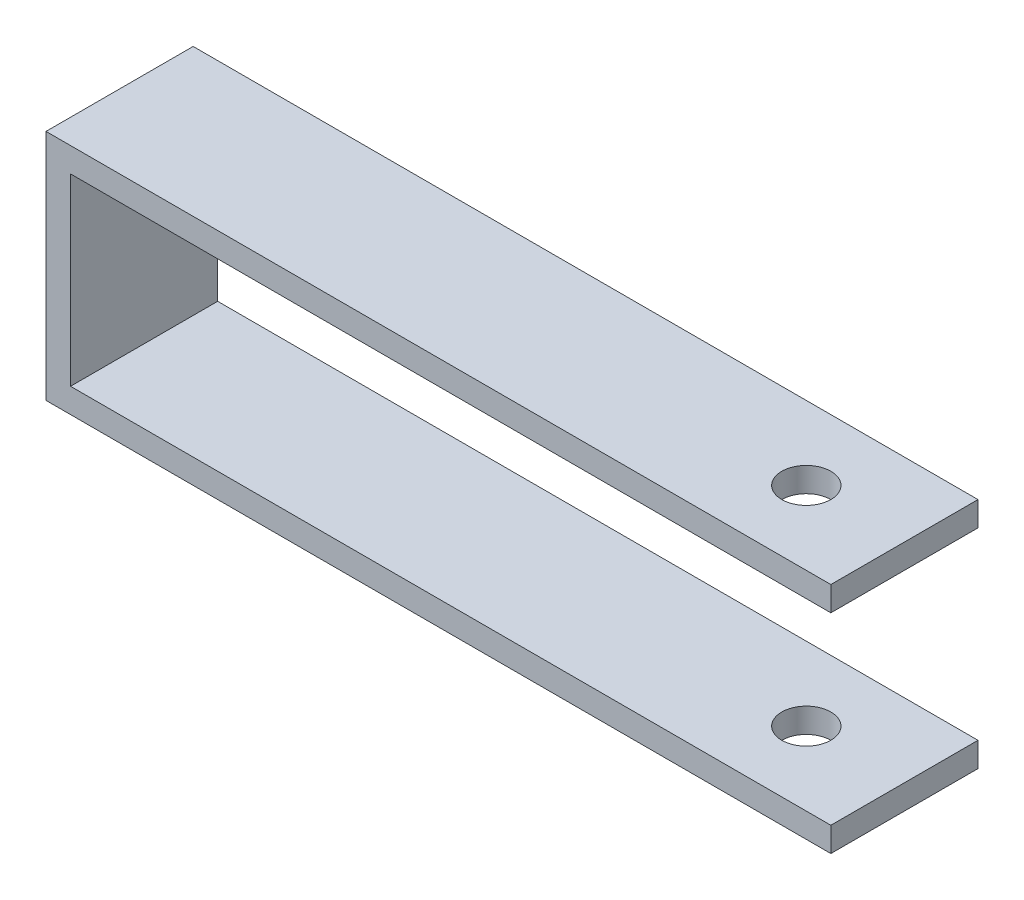
ISO-10303-21;
HEADER;
FILE_DESCRIPTION(('STEP AP214'),'2;1');
FILE_NAME('part.step','',(''),(''),'','','');
FILE_SCHEMA(('AUTOMOTIVE_DESIGN { 1 0 10303 214 1 1 1 1 }'));
ENDSEC;
DATA;
#1=APPLICATION_CONTEXT('core data for automotive mechanical design processes');
#2=APPLICATION_PROTOCOL_DEFINITION('international standard','automotive_design',2000,#1);
#3=PRODUCT_CONTEXT('',#1,'mechanical');
#4=PRODUCT('Part','Part','',(#3));
#5=PRODUCT_RELATED_PRODUCT_CATEGORY('part','',(#4));
#6=PRODUCT_DEFINITION_FORMATION('','',#4);
#7=PRODUCT_DEFINITION_CONTEXT('part definition',#1,'design');
#8=PRODUCT_DEFINITION('design','',#6,#7);
#9=PRODUCT_DEFINITION_SHAPE('','',#8);
#10=(LENGTH_UNIT() NAMED_UNIT(*) SI_UNIT(.MILLI.,.METRE.));
#11=(NAMED_UNIT(*) PLANE_ANGLE_UNIT() SI_UNIT($,.RADIAN.));
#12=(NAMED_UNIT(*) SI_UNIT($,.STERADIAN.) SOLID_ANGLE_UNIT());
#13=UNCERTAINTY_MEASURE_WITH_UNIT(LENGTH_MEASURE(1.E-05),#10,'distance_accuracy_value','');
#14=(GEOMETRIC_REPRESENTATION_CONTEXT(3) GLOBAL_UNCERTAINTY_ASSIGNED_CONTEXT((#13)) GLOBAL_UNIT_ASSIGNED_CONTEXT((#10,
#11,#12)) REPRESENTATION_CONTEXT('',''));
#15=CARTESIAN_POINT('',(0.,0.,0.));
#16=DIRECTION('',(0.,0.,1.));
#17=DIRECTION('',(1.,0.,0.));
#18=AXIS2_PLACEMENT_3D('',#15,#16,#17);
#19=CARTESIAN_POINT('',(-152.367582317073,0.,0.));
#20=DIRECTION('',(1.,0.,0.));
#21=DIRECTION('',(0.,0.,-1.));
#22=AXIS2_PLACEMENT_3D('',#19,#20,#21);
#23=PLANE('',#22);
#24=DIRECTION('',(0.,-1.,0.));
#25=VECTOR('',#24,1.);
#26=CARTESIAN_POINT('',(-152.367582317073,30.1625,-35.2174878048781));
#27=LINE('',#26,#25);
#28=CARTESIAN_POINT('',(-152.367582317073,26.9875,-35.2174878048781));
#29=VERTEX_POINT('',#28);
#30=CARTESIAN_POINT('',(-152.367582317073,3.175,-35.2174878048781));
#31=VERTEX_POINT('',#30);
#32=EDGE_CURVE('E53',#29,#31,#27,.T.);
#33=ORIENTED_EDGE('',*,*,#32,.F.);
#34=DIRECTION('',(0.,0.,1.));
#35=VECTOR('',#34,1.);
#36=CARTESIAN_POINT('',(-152.367582317073,26.9875,0.));
#37=LINE('',#36,#35);
#38=CARTESIAN_POINT('',(-152.367582317073,26.9875,-16.167487804878));
#39=VERTEX_POINT('',#38);
#40=EDGE_CURVE('E11',#29,#39,#37,.T.);
#41=ORIENTED_EDGE('',*,*,#40,.T.);
#42=DIRECTION('',(0.,1.,0.));
#43=VECTOR('',#42,1.);
#44=CARTESIAN_POINT('',(-152.367582317073,30.1625,-16.167487804878));
#45=LINE('',#44,#43);
#46=CARTESIAN_POINT('',(-152.367582317073,3.175,-16.167487804878));
#47=VERTEX_POINT('',#46);
#48=EDGE_CURVE('E134',#47,#39,#45,.T.);
#49=ORIENTED_EDGE('',*,*,#48,.F.);
#50=DIRECTION('',(0.,0.,-1.));
#51=VECTOR('',#50,1.);
#52=CARTESIAN_POINT('',(-152.367582317073,3.175,0.));
#53=LINE('',#52,#51);
#54=EDGE_CURVE('E138',#47,#31,#53,.T.);
#55=ORIENTED_EDGE('',*,*,#54,.T.);
#56=EDGE_LOOP('',(#33,#41,#49,#55));
#57=FACE_BOUND('',#56,.T.);
#58=ADVANCED_FACE('F33',(#57),#23,.T.);
#59=CARTESIAN_POINT('',(-155.542582317073,3.175,-35.2174878048781));
#60=DIRECTION('',(1.,0.,0.));
#61=DIRECTION('',(0.,0.,-1.));
#62=AXIS2_PLACEMENT_3D('',#59,#60,#61);
#63=PLANE('',#62);
#64=DIRECTION('',(0.,-1.,0.));
#65=VECTOR('',#64,1.);
#66=CARTESIAN_POINT('',(-155.542582317073,3.175,-35.2174878048781));
#67=LINE('',#66,#65);
#68=CARTESIAN_POINT('',(-155.542582317073,30.1625,-35.2174878048781));
#69=VERTEX_POINT('',#68);
#70=CARTESIAN_POINT('',(-155.542582317073,0.,-35.2174878048781));
#71=VERTEX_POINT('',#70);
#72=EDGE_CURVE('E156',#69,#71,#67,.T.);
#73=ORIENTED_EDGE('',*,*,#72,.T.);
#74=DIRECTION('',(0.,0.,1.));
#75=VECTOR('',#74,1.);
#76=CARTESIAN_POINT('',(-155.542582317073,0.,-35.2174878048781));
#77=LINE('',#76,#75);
#78=CARTESIAN_POINT('',(-155.542582317073,0.,-16.167487804878));
#79=VERTEX_POINT('',#78);
#80=EDGE_CURVE('E146',#71,#79,#77,.T.);
#81=ORIENTED_EDGE('',*,*,#80,.T.);
#82=DIRECTION('',(0.,-1.,0.));
#83=VECTOR('',#82,1.);
#84=CARTESIAN_POINT('',(-155.542582317073,3.175,-16.167487804878));
#85=LINE('',#84,#83);
#86=CARTESIAN_POINT('',(-155.542582317073,30.1625,-16.167487804878));
#87=VERTEX_POINT('',#86);
#88=EDGE_CURVE('E41',#87,#79,#85,.T.);
#89=ORIENTED_EDGE('',*,*,#88,.F.);
#90=DIRECTION('',(0.,0.,-1.));
#91=VECTOR('',#90,1.);
#92=CARTESIAN_POINT('',(-155.542582317073,30.1625,-16.167487804878));
#93=LINE('',#92,#91);
#94=EDGE_CURVE('E109',#87,#69,#93,.T.);
#95=ORIENTED_EDGE('',*,*,#94,.T.);
#96=EDGE_LOOP('',(#73,#81,#89,#95));
#97=FACE_BOUND('',#96,.T.);
#98=ADVANCED_FACE('F35',(#97),#63,.F.);
#99=CARTESIAN_POINT('',(-155.542582317073,3.175,-16.167487804878));
#100=DIRECTION('',(0.,0.,-1.));
#101=DIRECTION('',(-1.,0.,0.));
#102=AXIS2_PLACEMENT_3D('',#99,#100,#101);
#103=PLANE('',#102);
#104=ORIENTED_EDGE('',*,*,#88,.T.);
#105=DIRECTION('',(1.,0.,0.));
#106=VECTOR('',#105,1.);
#107=CARTESIAN_POINT('',(-155.542582317073,0.,-16.167487804878));
#108=LINE('',#107,#106);
#109=CARTESIAN_POINT('',(-53.9425823170732,0.,-16.167487804878));
#110=VERTEX_POINT('',#109);
#111=EDGE_CURVE('E159',#79,#110,#108,.T.);
#112=ORIENTED_EDGE('',*,*,#111,.T.);
#113=DIRECTION('',(0.,-1.,0.));
#114=VECTOR('',#113,1.);
#115=CARTESIAN_POINT('',(-53.9425823170732,3.175,-16.167487804878));
#116=LINE('',#115,#114);
#117=CARTESIAN_POINT('',(-53.9425823170732,3.175,-16.167487804878));
#118=VERTEX_POINT('',#117);
#119=EDGE_CURVE('E169',#118,#110,#116,.T.);
#120=ORIENTED_EDGE('',*,*,#119,.F.);
#121=DIRECTION('',(1.,0.,0.));
#122=VECTOR('',#121,1.);
#123=CARTESIAN_POINT('',(-155.542582317073,3.175,-16.167487804878));
#124=LINE('',#123,#122);
#125=EDGE_CURVE('E149',#47,#118,#124,.T.);
#126=ORIENTED_EDGE('',*,*,#125,.F.);
#127=ORIENTED_EDGE('',*,*,#48,.T.);
#128=DIRECTION('',(1.,0.,0.));
#129=VECTOR('',#128,1.);
#130=CARTESIAN_POINT('',(-155.542582317073,26.9875,-16.167487804878));
#131=LINE('',#130,#129);
#132=CARTESIAN_POINT('',(-53.9425823170732,26.9875,-16.167487804878));
#133=VERTEX_POINT('',#132);
#134=EDGE_CURVE('E117',#39,#133,#131,.T.);
#135=ORIENTED_EDGE('',*,*,#134,.T.);
#136=DIRECTION('',(0.,-1.,0.));
#137=VECTOR('',#136,1.);
#138=CARTESIAN_POINT('',(-53.9425823170732,30.1625,-16.167487804878));
#139=LINE('',#138,#137);
#140=CARTESIAN_POINT('',(-53.9425823170732,30.1625,-16.167487804878));
#141=VERTEX_POINT('',#140);
#142=EDGE_CURVE('E114',#141,#133,#139,.T.);
#143=ORIENTED_EDGE('',*,*,#142,.F.);
#144=DIRECTION('',(-1.,0.,0.));
#145=VECTOR('',#144,1.);
#146=CARTESIAN_POINT('',(-152.367582317073,30.1625,-16.167487804878));
#147=LINE('',#146,#145);
#148=EDGE_CURVE('E100',#141,#87,#147,.T.);
#149=ORIENTED_EDGE('',*,*,#148,.T.);
#150=EDGE_LOOP('',(#104,#112,#120,#126,#127,#135,#143,#149));
#151=FACE_BOUND('',#150,.T.);
#152=ADVANCED_FACE('F115',(#151),#103,.F.);
#153=CARTESIAN_POINT('',(-53.9425823170732,3.175,-35.2174878048781));
#154=DIRECTION('',(-1.,0.,0.));
#155=DIRECTION('',(0.,0.,1.));
#156=AXIS2_PLACEMENT_3D('',#153,#154,#155);
#157=PLANE('',#156);
#158=DIRECTION('',(0.,0.,-1.));
#159=VECTOR('',#158,1.);
#160=CARTESIAN_POINT('',(-53.9425823170732,0.,-35.2174878048781));
#161=LINE('',#160,#159);
#162=CARTESIAN_POINT('',(-53.9425823170732,0.,-35.2174878048781));
#163=VERTEX_POINT('',#162);
#164=EDGE_CURVE('E161',#110,#163,#161,.T.);
#165=ORIENTED_EDGE('',*,*,#164,.T.);
#166=DIRECTION('',(0.,-1.,0.));
#167=VECTOR('',#166,1.);
#168=CARTESIAN_POINT('',(-53.9425823170732,3.175,-35.2174878048781));
#169=LINE('',#168,#167);
#170=CARTESIAN_POINT('',(-53.9425823170732,3.175,-35.2174878048781));
#171=VERTEX_POINT('',#170);
#172=EDGE_CURVE('E166',#171,#163,#169,.T.);
#173=ORIENTED_EDGE('',*,*,#172,.F.);
#174=DIRECTION('',(0.,0.,-1.));
#175=VECTOR('',#174,1.);
#176=CARTESIAN_POINT('',(-53.9425823170732,3.175,-35.2174878048781));
#177=LINE('',#176,#175);
#178=EDGE_CURVE('E151',#118,#171,#177,.T.);
#179=ORIENTED_EDGE('',*,*,#178,.F.);
#180=ORIENTED_EDGE('',*,*,#119,.T.);
#181=EDGE_LOOP('',(#165,#173,#179,#180));
#182=FACE_BOUND('',#181,.T.);
#183=ADVANCED_FACE('F183',(#182),#157,.F.);
#184=CARTESIAN_POINT('',(-155.542582317073,3.175,-35.2174878048781));
#185=DIRECTION('',(0.,0.,1.));
#186=DIRECTION('',(1.,0.,0.));
#187=AXIS2_PLACEMENT_3D('',#184,#185,#186);
#188=PLANE('',#187);
#189=DIRECTION('',(-1.,0.,0.));
#190=VECTOR('',#189,1.);
#191=CARTESIAN_POINT('',(-152.367582317073,30.1625,-35.2174878048781));
#192=LINE('',#191,#190);
#193=CARTESIAN_POINT('',(-53.9425823170732,30.1625,-35.2174878048781));
#194=VERTEX_POINT('',#193);
#195=EDGE_CURVE('E111',#194,#69,#192,.T.);
#196=ORIENTED_EDGE('',*,*,#195,.F.);
#197=DIRECTION('',(0.,-1.,0.));
#198=VECTOR('',#197,1.);
#199=CARTESIAN_POINT('',(-53.9425823170732,30.1625,-35.2174878048781));
#200=LINE('',#199,#198);
#201=CARTESIAN_POINT('',(-53.9425823170732,26.9875,-35.2174878048781));
#202=VERTEX_POINT('',#201);
#203=EDGE_CURVE('E120',#194,#202,#200,.T.);
#204=ORIENTED_EDGE('',*,*,#203,.T.);
#205=DIRECTION('',(-1.,0.,0.));
#206=VECTOR('',#205,1.);
#207=CARTESIAN_POINT('',(-155.542582317073,26.9875,-35.2174878048781));
#208=LINE('',#207,#206);
#209=EDGE_CURVE('E48',#202,#29,#208,.T.);
#210=ORIENTED_EDGE('',*,*,#209,.T.);
#211=ORIENTED_EDGE('',*,*,#32,.T.);
#212=DIRECTION('',(-1.,0.,0.));
#213=VECTOR('',#212,1.);
#214=CARTESIAN_POINT('',(-155.542582317073,3.175,-35.2174878048781));
#215=LINE('',#214,#213);
#216=EDGE_CURVE('E154',#171,#31,#215,.T.);
#217=ORIENTED_EDGE('',*,*,#216,.F.);
#218=ORIENTED_EDGE('',*,*,#172,.T.);
#219=DIRECTION('',(-1.,0.,0.));
#220=VECTOR('',#219,1.);
#221=CARTESIAN_POINT('',(-155.542582317073,0.,-35.2174878048781));
#222=LINE('',#221,#220);
#223=EDGE_CURVE('E152',#163,#71,#222,.T.);
#224=ORIENTED_EDGE('',*,*,#223,.T.);
#225=ORIENTED_EDGE('',*,*,#72,.F.);
#226=EDGE_LOOP('',(#196,#204,#210,#211,#217,#218,#224,#225));
#227=FACE_BOUND('',#226,.T.);
#228=ADVANCED_FACE('F179',(#227),#188,.F.);
#229=CARTESIAN_POINT('',(0.,3.175,0.));
#230=DIRECTION('',(0.,1.,0.));
#231=DIRECTION('',(0.,0.,1.));
#232=AXIS2_PLACEMENT_3D('',#229,#230,#231);
#233=PLANE('',#232);
#234=ORIENTED_EDGE('',*,*,#54,.F.);
#235=ORIENTED_EDGE('',*,*,#125,.T.);
#236=ORIENTED_EDGE('',*,*,#178,.T.);
#237=ORIENTED_EDGE('',*,*,#216,.T.);
#238=EDGE_LOOP('',(#234,#235,#236,#237));
#239=FACE_BOUND('',#238,.T.);
#240=CARTESIAN_POINT('',(-66.6425823170732,3.175,-25.6924878048781));
#241=DIRECTION('',(0.,1.,0.));
#242=DIRECTION('',(0.,0.,1.));
#243=AXIS2_PLACEMENT_3D('',#240,#241,#242);
#244=CIRCLE('',#243,3.175);
#245=CARTESIAN_POINT('',(-66.6425823170732,3.175,-22.5174878048781));
#246=VERTEX_POINT('',#245);
#247=EDGE_CURVE('E142',#246,#246,#244,.T.);
#248=ORIENTED_EDGE('',*,*,#247,.F.);
#249=EDGE_LOOP('',(#248));
#250=FACE_BOUND('',#249,.T.);
#251=ADVANCED_FACE('F243',(#239,#250),#233,.T.);
#252=CARTESIAN_POINT('',(0.,0.,0.));
#253=DIRECTION('',(0.,1.,0.));
#254=DIRECTION('',(0.,0.,1.));
#255=AXIS2_PLACEMENT_3D('',#252,#253,#254);
#256=PLANE('',#255);
#257=CARTESIAN_POINT('',(-66.6425823170732,0.,-25.6924878048781));
#258=DIRECTION('',(0.,1.,0.));
#259=DIRECTION('',(0.,0.,1.));
#260=AXIS2_PLACEMENT_3D('',#257,#258,#259);
#261=CIRCLE('',#260,3.175);
#262=CARTESIAN_POINT('',(-66.6425823170732,0.,-22.5174878048781));
#263=VERTEX_POINT('',#262);
#264=EDGE_CURVE('E143',#263,#263,#261,.T.);
#265=ORIENTED_EDGE('',*,*,#264,.T.);
#266=EDGE_LOOP('',(#265));
#267=FACE_BOUND('',#266,.T.);
#268=ORIENTED_EDGE('',*,*,#164,.F.);
#269=ORIENTED_EDGE('',*,*,#111,.F.);
#270=ORIENTED_EDGE('',*,*,#80,.F.);
#271=ORIENTED_EDGE('',*,*,#223,.F.);
#272=EDGE_LOOP('',(#268,#269,#270,#271));
#273=FACE_BOUND('',#272,.T.);
#274=ADVANCED_FACE('F177',(#267,#273),#256,.F.);
#275=CARTESIAN_POINT('',(-66.6425823170732,0.,-25.6924878048781));
#276=DIRECTION('',(0.,1.,0.));
#277=DIRECTION('',(0.,0.,1.));
#278=AXIS2_PLACEMENT_3D('',#275,#276,#277);
#279=CYLINDRICAL_SURFACE('',#278,3.175);
#280=ORIENTED_EDGE('',*,*,#264,.F.);
#281=EDGE_LOOP('',(#280));
#282=FACE_BOUND('',#281,.T.);
#283=ORIENTED_EDGE('',*,*,#247,.T.);
#284=EDGE_LOOP('',(#283));
#285=FACE_BOUND('',#284,.T.);
#286=ADVANCED_FACE('F201',(#282,#285),#279,.F.);
#287=CARTESIAN_POINT('',(-152.367582317073,30.1625,-16.167487804878));
#288=DIRECTION('',(0.,1.,0.));
#289=DIRECTION('',(0.,0.,1.));
#290=AXIS2_PLACEMENT_3D('',#287,#288,#289);
#291=PLANE('',#290);
#292=ORIENTED_EDGE('',*,*,#94,.F.);
#293=ORIENTED_EDGE('',*,*,#148,.F.);
#294=DIRECTION('',(0.,0.,-1.));
#295=VECTOR('',#294,1.);
#296=CARTESIAN_POINT('',(-53.9425823170732,30.1625,-35.2174878048781));
#297=LINE('',#296,#295);
#298=EDGE_CURVE('E106',#141,#194,#297,.T.);
#299=ORIENTED_EDGE('',*,*,#298,.T.);
#300=ORIENTED_EDGE('',*,*,#195,.T.);
#301=EDGE_LOOP('',(#292,#293,#299,#300));
#302=FACE_BOUND('',#301,.T.);
#303=CARTESIAN_POINT('',(-66.6425823170732,30.1625,-25.6924878048781));
#304=DIRECTION('',(0.,1.,0.));
#305=DIRECTION('',(0.,0.,1.));
#306=AXIS2_PLACEMENT_3D('',#303,#304,#305);
#307=CIRCLE('',#306,3.175);
#308=CARTESIAN_POINT('',(-66.6425823170732,30.1625,-22.5174878048781));
#309=VERTEX_POINT('',#308);
#310=EDGE_CURVE('E132',#309,#309,#307,.T.);
#311=ORIENTED_EDGE('',*,*,#310,.F.);
#312=EDGE_LOOP('',(#311));
#313=FACE_BOUND('',#312,.T.);
#314=ADVANCED_FACE('F102',(#302,#313),#291,.T.);
#315=CARTESIAN_POINT('',(0.,26.9875,0.));
#316=DIRECTION('',(0.,1.,0.));
#317=DIRECTION('',(0.,0.,1.));
#318=AXIS2_PLACEMENT_3D('',#315,#316,#317);
#319=PLANE('',#318);
#320=ORIENTED_EDGE('',*,*,#40,.F.);
#321=ORIENTED_EDGE('',*,*,#209,.F.);
#322=DIRECTION('',(0.,0.,-1.));
#323=VECTOR('',#322,1.);
#324=CARTESIAN_POINT('',(-53.9425823170732,26.9875,-35.2174878048781));
#325=LINE('',#324,#323);
#326=EDGE_CURVE('E125',#133,#202,#325,.T.);
#327=ORIENTED_EDGE('',*,*,#326,.F.);
#328=ORIENTED_EDGE('',*,*,#134,.F.);
#329=EDGE_LOOP('',(#320,#321,#327,#328));
#330=FACE_BOUND('',#329,.T.);
#331=CARTESIAN_POINT('',(-66.6425823170732,26.9875,-25.6924878048781));
#332=DIRECTION('',(0.,1.,0.));
#333=DIRECTION('',(0.,0.,1.));
#334=AXIS2_PLACEMENT_3D('',#331,#332,#333);
#335=CIRCLE('',#334,3.175);
#336=CARTESIAN_POINT('',(-66.6425823170732,26.9875,-22.5174878048781));
#337=VERTEX_POINT('',#336);
#338=EDGE_CURVE('E129',#337,#337,#335,.T.);
#339=ORIENTED_EDGE('',*,*,#338,.T.);
#340=EDGE_LOOP('',(#339));
#341=FACE_BOUND('',#340,.T.);
#342=ADVANCED_FACE('F189',(#330,#341),#319,.F.);
#343=CARTESIAN_POINT('',(-53.9425823170732,30.1625,-35.2174878048781));
#344=DIRECTION('',(-1.,0.,0.));
#345=DIRECTION('',(0.,0.,1.));
#346=AXIS2_PLACEMENT_3D('',#343,#344,#345);
#347=PLANE('',#346);
#348=ORIENTED_EDGE('',*,*,#326,.T.);
#349=ORIENTED_EDGE('',*,*,#203,.F.);
#350=ORIENTED_EDGE('',*,*,#298,.F.);
#351=ORIENTED_EDGE('',*,*,#142,.T.);
#352=EDGE_LOOP('',(#348,#349,#350,#351));
#353=FACE_BOUND('',#352,.T.);
#354=ADVANCED_FACE('F122',(#353),#347,.F.);
#355=CARTESIAN_POINT('',(-66.6425823170732,30.1625,-25.6924878048781));
#356=DIRECTION('',(0.,-1.,0.));
#357=DIRECTION('',(0.,0.,-1.));
#358=AXIS2_PLACEMENT_3D('',#355,#356,#357);
#359=CYLINDRICAL_SURFACE('',#358,3.175);
#360=ORIENTED_EDGE('',*,*,#310,.T.);
#361=EDGE_LOOP('',(#360));
#362=FACE_BOUND('',#361,.T.);
#363=ORIENTED_EDGE('',*,*,#338,.F.);
#364=EDGE_LOOP('',(#363));
#365=FACE_BOUND('',#364,.T.);
#366=ADVANCED_FACE('F199',(#362,#365),#359,.F.);
#367=CLOSED_SHELL('',(#58,#98,#152,#183,#228,#251,#274,#286,#314,#342,#354,#366));
#368=MANIFOLD_SOLID_BREP('B2',#367);
#369=ADVANCED_BREP_SHAPE_REPRESENTATION('',(#18,#368),#14);
#370=SHAPE_DEFINITION_REPRESENTATION(#9,#369);
ENDSEC;
END-ISO-10303-21;
